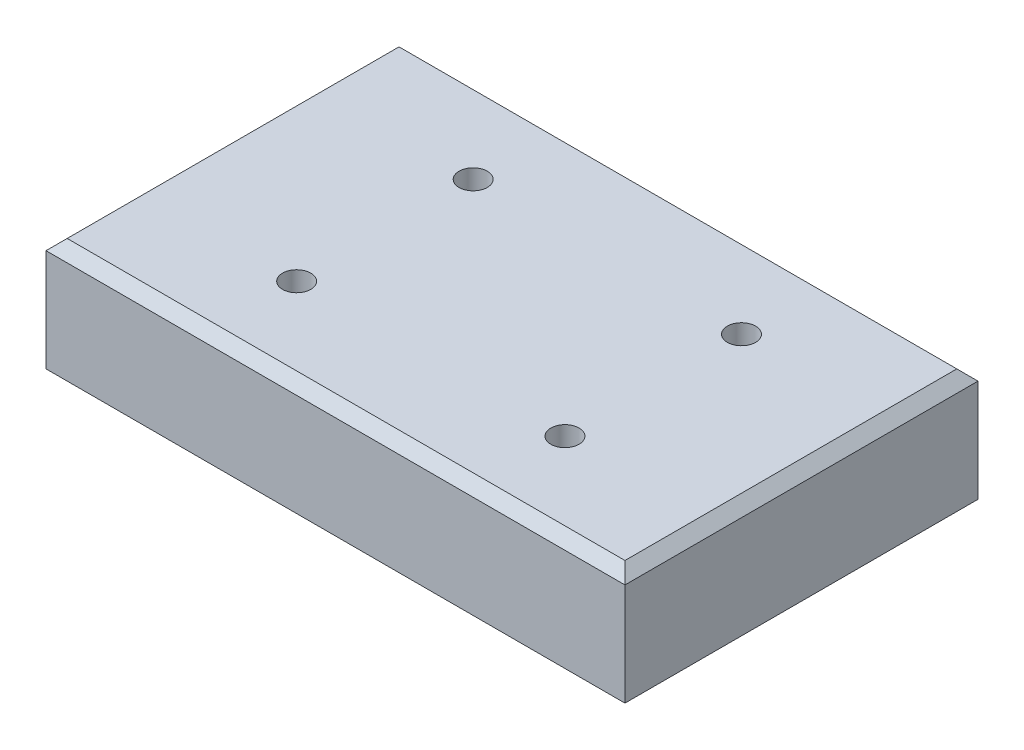
ISO-10303-21;
HEADER;
FILE_DESCRIPTION(('STEP AP214'),'2;1');
FILE_NAME('part.step','',(''),(''),'','','');
FILE_SCHEMA(('AUTOMOTIVE_DESIGN { 1 0 10303 214 1 1 1 1 }'));
ENDSEC;
DATA;
#1=APPLICATION_CONTEXT('core data for automotive mechanical design processes');
#2=APPLICATION_PROTOCOL_DEFINITION('international standard','automotive_design',2000,#1);
#3=PRODUCT_CONTEXT('',#1,'mechanical');
#4=PRODUCT('Part','Part','',(#3));
#5=PRODUCT_RELATED_PRODUCT_CATEGORY('part','',(#4));
#6=PRODUCT_DEFINITION_FORMATION('','',#4);
#7=PRODUCT_DEFINITION_CONTEXT('part definition',#1,'design');
#8=PRODUCT_DEFINITION('design','',#6,#7);
#9=PRODUCT_DEFINITION_SHAPE('','',#8);
#10=(LENGTH_UNIT() NAMED_UNIT(*) SI_UNIT(.MILLI.,.METRE.));
#11=(NAMED_UNIT(*) PLANE_ANGLE_UNIT() SI_UNIT($,.RADIAN.));
#12=(NAMED_UNIT(*) SI_UNIT($,.STERADIAN.) SOLID_ANGLE_UNIT());
#13=UNCERTAINTY_MEASURE_WITH_UNIT(LENGTH_MEASURE(1.E-05),#10,'distance_accuracy_value','');
#14=(GEOMETRIC_REPRESENTATION_CONTEXT(3) GLOBAL_UNCERTAINTY_ASSIGNED_CONTEXT((#13)) GLOBAL_UNIT_ASSIGNED_CONTEXT((#10,
#11,#12)) REPRESENTATION_CONTEXT('',''));
#15=CARTESIAN_POINT('',(0.,0.,0.));
#16=DIRECTION('',(0.,0.,1.));
#17=DIRECTION('',(1.,0.,0.));
#18=AXIS2_PLACEMENT_3D('',#15,#16,#17);
#19=CARTESIAN_POINT('',(-41.,8.,-25.));
#20=DIRECTION('',(1.,0.,0.));
#21=DIRECTION('',(0.,0.,-1.));
#22=AXIS2_PLACEMENT_3D('',#19,#20,#21);
#23=PLANE('',#22);
#24=DIRECTION('',(0.,-1.,0.));
#25=VECTOR('',#24,1.);
#26=CARTESIAN_POINT('',(-41.,8.,25.));
#27=LINE('',#26,#25);
#28=CARTESIAN_POINT('',(-41.,6.49999999999998,25.));
#29=VERTEX_POINT('',#28);
#30=CARTESIAN_POINT('',(-41.,-8.,25.));
#31=VERTEX_POINT('',#30);
#32=EDGE_CURVE('E182',#29,#31,#27,.T.);
#33=ORIENTED_EDGE('',*,*,#32,.F.);
#34=DIRECTION('',(0.,0.,-1.));
#35=VECTOR('',#34,1.);
#36=CARTESIAN_POINT('',(-41.,6.49999999999998,-25.));
#37=LINE('',#36,#35);
#38=CARTESIAN_POINT('',(-41.,6.49999999999998,-25.));
#39=VERTEX_POINT('',#38);
#40=EDGE_CURVE('E193',#29,#39,#37,.T.);
#41=ORIENTED_EDGE('',*,*,#40,.T.);
#42=DIRECTION('',(0.,-1.,0.));
#43=VECTOR('',#42,1.);
#44=CARTESIAN_POINT('',(-41.,8.,-25.));
#45=LINE('',#44,#43);
#46=CARTESIAN_POINT('',(-41.,-8.,-25.));
#47=VERTEX_POINT('',#46);
#48=EDGE_CURVE('E176',#39,#47,#45,.T.);
#49=ORIENTED_EDGE('',*,*,#48,.T.);
#50=DIRECTION('',(0.,0.,1.));
#51=VECTOR('',#50,1.);
#52=CARTESIAN_POINT('',(-41.,-8.,-25.));
#53=LINE('',#52,#51);
#54=EDGE_CURVE('E164',#47,#31,#53,.T.);
#55=ORIENTED_EDGE('',*,*,#54,.T.);
#56=EDGE_LOOP('',(#33,#41,#49,#55));
#57=FACE_BOUND('',#56,.T.);
#58=ADVANCED_FACE('F45',(#57),#23,.F.);
#59=CARTESIAN_POINT('',(41.,8.,25.));
#60=DIRECTION('',(0.,0.,-1.));
#61=DIRECTION('',(-1.,0.,0.));
#62=AXIS2_PLACEMENT_3D('',#59,#60,#61);
#63=PLANE('',#62);
#64=DIRECTION('',(0.,-1.,0.));
#65=VECTOR('',#64,1.);
#66=CARTESIAN_POINT('',(41.,8.,25.));
#67=LINE('',#66,#65);
#68=CARTESIAN_POINT('',(41.,6.49999999999998,25.));
#69=VERTEX_POINT('',#68);
#70=CARTESIAN_POINT('',(41.,-8.,25.));
#71=VERTEX_POINT('',#70);
#72=EDGE_CURVE('E180',#69,#71,#67,.T.);
#73=ORIENTED_EDGE('',*,*,#72,.F.);
#74=DIRECTION('',(-1.,0.,0.));
#75=VECTOR('',#74,1.);
#76=CARTESIAN_POINT('',(41.,6.49999999999998,25.));
#77=LINE('',#76,#75);
#78=EDGE_CURVE('E11',#69,#29,#77,.T.);
#79=ORIENTED_EDGE('',*,*,#78,.T.);
#80=ORIENTED_EDGE('',*,*,#32,.T.);
#81=DIRECTION('',(1.,0.,0.));
#82=VECTOR('',#81,1.);
#83=CARTESIAN_POINT('',(41.,-8.,25.));
#84=LINE('',#83,#82);
#85=EDGE_CURVE('E167',#31,#71,#84,.T.);
#86=ORIENTED_EDGE('',*,*,#85,.T.);
#87=EDGE_LOOP('',(#73,#79,#80,#86));
#88=FACE_BOUND('',#87,.T.);
#89=ADVANCED_FACE('F218',(#88),#63,.F.);
#90=CARTESIAN_POINT('',(41.,8.,-25.));
#91=DIRECTION('',(-1.,0.,0.));
#92=DIRECTION('',(0.,0.,1.));
#93=AXIS2_PLACEMENT_3D('',#90,#91,#92);
#94=PLANE('',#93);
#95=DIRECTION('',(0.,-1.,0.));
#96=VECTOR('',#95,1.);
#97=CARTESIAN_POINT('',(41.,8.,-25.));
#98=LINE('',#97,#96);
#99=CARTESIAN_POINT('',(41.,6.49999999999998,-25.));
#100=VERTEX_POINT('',#99);
#101=CARTESIAN_POINT('',(41.,-8.,-25.));
#102=VERTEX_POINT('',#101);
#103=EDGE_CURVE('E178',#100,#102,#98,.T.);
#104=ORIENTED_EDGE('',*,*,#103,.F.);
#105=DIRECTION('',(0.,0.,1.));
#106=VECTOR('',#105,1.);
#107=CARTESIAN_POINT('',(41.,6.49999999999998,-25.));
#108=LINE('',#107,#106);
#109=EDGE_CURVE('E55',#100,#69,#108,.T.);
#110=ORIENTED_EDGE('',*,*,#109,.T.);
#111=ORIENTED_EDGE('',*,*,#72,.T.);
#112=DIRECTION('',(0.,0.,-1.));
#113=VECTOR('',#112,1.);
#114=CARTESIAN_POINT('',(41.,-8.,-25.));
#115=LINE('',#114,#113);
#116=EDGE_CURVE('E170',#71,#102,#115,.T.);
#117=ORIENTED_EDGE('',*,*,#116,.T.);
#118=EDGE_LOOP('',(#104,#110,#111,#117));
#119=FACE_BOUND('',#118,.T.);
#120=ADVANCED_FACE('F241',(#119),#94,.F.);
#121=CARTESIAN_POINT('',(41.,8.,-25.));
#122=DIRECTION('',(0.,0.,1.));
#123=DIRECTION('',(1.,0.,0.));
#124=AXIS2_PLACEMENT_3D('',#121,#122,#123);
#125=PLANE('',#124);
#126=ORIENTED_EDGE('',*,*,#48,.F.);
#127=DIRECTION('',(1.,0.,0.));
#128=VECTOR('',#127,1.);
#129=CARTESIAN_POINT('',(41.,6.49999999999998,-25.));
#130=LINE('',#129,#128);
#131=EDGE_CURVE('E70',#39,#100,#130,.T.);
#132=ORIENTED_EDGE('',*,*,#131,.T.);
#133=ORIENTED_EDGE('',*,*,#103,.T.);
#134=DIRECTION('',(-1.,0.,0.));
#135=VECTOR('',#134,1.);
#136=CARTESIAN_POINT('',(41.,-8.,-25.));
#137=LINE('',#136,#135);
#138=EDGE_CURVE('E173',#102,#47,#137,.T.);
#139=ORIENTED_EDGE('',*,*,#138,.T.);
#140=EDGE_LOOP('',(#126,#132,#133,#139));
#141=FACE_BOUND('',#140,.T.);
#142=ADVANCED_FACE('F230',(#141),#125,.F.);
#143=CARTESIAN_POINT('',(0.,8.,0.));
#144=DIRECTION('',(0.,-1.,0.));
#145=DIRECTION('',(0.,0.,-1.));
#146=AXIS2_PLACEMENT_3D('',#143,#144,#145);
#147=PLANE('',#146);
#148=CARTESIAN_POINT('',(-18.,8.,-12.5));
#149=DIRECTION('',(0.,1.,0.));
#150=DIRECTION('',(0.,0.,1.));
#151=AXIS2_PLACEMENT_3D('',#148,#149,#150);
#152=CIRCLE('',#151,2.);
#153=CARTESIAN_POINT('',(-18.,8.,-10.5));
#154=VERTEX_POINT('',#153);
#155=EDGE_CURVE('E493',#154,#154,#152,.T.);
#156=ORIENTED_EDGE('',*,*,#155,.F.);
#157=EDGE_LOOP('',(#156));
#158=FACE_BOUND('',#157,.T.);
#159=CARTESIAN_POINT('',(-18.,8.,12.5));
#160=DIRECTION('',(0.,1.,0.));
#161=DIRECTION('',(0.,0.,1.));
#162=AXIS2_PLACEMENT_3D('',#159,#160,#161);
#163=CIRCLE('',#162,2.);
#164=CARTESIAN_POINT('',(-18.,8.,14.5));
#165=VERTEX_POINT('',#164);
#166=EDGE_CURVE('E120',#165,#165,#163,.T.);
#167=ORIENTED_EDGE('',*,*,#166,.F.);
#168=EDGE_LOOP('',(#167));
#169=FACE_BOUND('',#168,.T.);
#170=CARTESIAN_POINT('',(20.,8.,12.5));
#171=DIRECTION('',(0.,1.,0.));
#172=DIRECTION('',(0.,0.,1.));
#173=AXIS2_PLACEMENT_3D('',#170,#171,#172);
#174=CIRCLE('',#173,2.);
#175=CARTESIAN_POINT('',(20.,8.,14.5));
#176=VERTEX_POINT('',#175);
#177=EDGE_CURVE('E139',#176,#176,#174,.T.);
#178=ORIENTED_EDGE('',*,*,#177,.F.);
#179=EDGE_LOOP('',(#178));
#180=FACE_BOUND('',#179,.T.);
#181=CARTESIAN_POINT('',(20.,8.,-12.5));
#182=DIRECTION('',(0.,1.,0.));
#183=DIRECTION('',(0.,0.,1.));
#184=AXIS2_PLACEMENT_3D('',#181,#182,#183);
#185=CIRCLE('',#184,2.);
#186=CARTESIAN_POINT('',(20.,8.,-10.5));
#187=VERTEX_POINT('',#186);
#188=EDGE_CURVE('E151',#187,#187,#185,.T.);
#189=ORIENTED_EDGE('',*,*,#188,.F.);
#190=EDGE_LOOP('',(#189));
#191=FACE_BOUND('',#190,.T.);
#192=DIRECTION('',(-1.,0.,0.));
#193=VECTOR('',#192,1.);
#194=CARTESIAN_POINT('',(0.,8.,-23.5));
#195=LINE('',#194,#193);
#196=CARTESIAN_POINT('',(39.5,8.,-23.5));
#197=VERTEX_POINT('',#196);
#198=CARTESIAN_POINT('',(-39.5,8.,-23.5));
#199=VERTEX_POINT('',#198);
#200=EDGE_CURVE('E188',#197,#199,#195,.T.);
#201=ORIENTED_EDGE('',*,*,#200,.T.);
#202=DIRECTION('',(0.,0.,1.));
#203=VECTOR('',#202,1.);
#204=CARTESIAN_POINT('',(-39.5,8.,0.));
#205=LINE('',#204,#203);
#206=CARTESIAN_POINT('',(-39.5,8.,23.5));
#207=VERTEX_POINT('',#206);
#208=EDGE_CURVE('E190',#199,#207,#205,.T.);
#209=ORIENTED_EDGE('',*,*,#208,.T.);
#210=DIRECTION('',(1.,0.,0.));
#211=VECTOR('',#210,1.);
#212=CARTESIAN_POINT('',(0.,8.,23.5));
#213=LINE('',#212,#211);
#214=CARTESIAN_POINT('',(39.5,8.,23.5));
#215=VERTEX_POINT('',#214);
#216=EDGE_CURVE('E184',#207,#215,#213,.T.);
#217=ORIENTED_EDGE('',*,*,#216,.T.);
#218=DIRECTION('',(0.,0.,-1.));
#219=VECTOR('',#218,1.);
#220=CARTESIAN_POINT('',(39.5,8.,0.));
#221=LINE('',#220,#219);
#222=EDGE_CURVE('E186',#215,#197,#221,.T.);
#223=ORIENTED_EDGE('',*,*,#222,.T.);
#224=EDGE_LOOP('',(#201,#209,#217,#223));
#225=FACE_BOUND('',#224,.T.);
#226=ADVANCED_FACE('F227',(#158,#169,#180,#191,#225),#147,.F.);
#227=CARTESIAN_POINT('',(0.,-8.,0.));
#228=DIRECTION('',(0.,-1.,0.));
#229=DIRECTION('',(0.,0.,-1.));
#230=AXIS2_PLACEMENT_3D('',#227,#228,#229);
#231=PLANE('',#230);
#232=ORIENTED_EDGE('',*,*,#54,.F.);
#233=ORIENTED_EDGE('',*,*,#138,.F.);
#234=ORIENTED_EDGE('',*,*,#116,.F.);
#235=ORIENTED_EDGE('',*,*,#85,.F.);
#236=EDGE_LOOP('',(#232,#233,#234,#235));
#237=FACE_BOUND('',#236,.T.);
#238=ADVANCED_FACE('F229',(#237),#231,.T.);
#239=CARTESIAN_POINT('',(39.5,8.,0.));
#240=DIRECTION('',(-0.707106781186551,-0.707106781186544,0.));
#241=DIRECTION('',(0.,0.,-1.));
#242=AXIS2_PLACEMENT_3D('',#239,#240,#241);
#243=PLANE('',#242);
#244=DIRECTION('',(-0.577350269189624,0.577350269189629,-0.577350269189624));
#245=VECTOR('',#244,1.);
#246=CARTESIAN_POINT('',(26.3333333333334,21.1666666666667,10.3333333333334));
#247=LINE('',#246,#245);
#248=EDGE_CURVE('E200',#69,#215,#247,.T.);
#249=ORIENTED_EDGE('',*,*,#248,.F.);
#250=ORIENTED_EDGE('',*,*,#109,.F.);
#251=DIRECTION('',(-0.577350269189624,0.577350269189629,0.577350269189624));
#252=VECTOR('',#251,1.);
#253=CARTESIAN_POINT('',(31.6666666666667,15.8333333333334,-15.6666666666667));
#254=LINE('',#253,#252);
#255=EDGE_CURVE('E50',#197,#100,#254,.F.);
#256=ORIENTED_EDGE('',*,*,#255,.F.);
#257=ORIENTED_EDGE('',*,*,#222,.F.);
#258=EDGE_LOOP('',(#249,#250,#256,#257));
#259=FACE_BOUND('',#258,.T.);
#260=ADVANCED_FACE('F48',(#259),#243,.F.);
#261=CARTESIAN_POINT('',(0.,8.,-23.5));
#262=DIRECTION('',(0.,-0.707106781186544,0.707106781186551));
#263=DIRECTION('',(-1.,0.,0.));
#264=AXIS2_PLACEMENT_3D('',#261,#262,#263);
#265=PLANE('',#264);
#266=ORIENTED_EDGE('',*,*,#255,.T.);
#267=ORIENTED_EDGE('',*,*,#131,.F.);
#268=DIRECTION('',(0.577350269189623,0.57735026918963,0.577350269189624));
#269=VECTOR('',#268,1.);
#270=CARTESIAN_POINT('',(-26.3333333333335,21.1666666666667,-10.3333333333334));
#271=LINE('',#270,#269);
#272=EDGE_CURVE('E199',#199,#39,#271,.F.);
#273=ORIENTED_EDGE('',*,*,#272,.F.);
#274=ORIENTED_EDGE('',*,*,#200,.F.);
#275=EDGE_LOOP('',(#266,#267,#273,#274));
#276=FACE_BOUND('',#275,.T.);
#277=ADVANCED_FACE('F210',(#276),#265,.F.);
#278=CARTESIAN_POINT('',(0.,8.,23.5));
#279=DIRECTION('',(0.,-0.707106781186544,-0.707106781186551));
#280=DIRECTION('',(1.,0.,0.));
#281=AXIS2_PLACEMENT_3D('',#278,#279,#280);
#282=PLANE('',#281);
#283=ORIENTED_EDGE('',*,*,#248,.T.);
#284=ORIENTED_EDGE('',*,*,#216,.F.);
#285=DIRECTION('',(-0.577350269189623,-0.57735026918963,0.577350269189625));
#286=VECTOR('',#285,1.);
#287=CARTESIAN_POINT('',(-26.3333333333334,21.1666666666667,10.3333333333334));
#288=LINE('',#287,#286);
#289=EDGE_CURVE('E163',#29,#207,#288,.F.);
#290=ORIENTED_EDGE('',*,*,#289,.F.);
#291=ORIENTED_EDGE('',*,*,#78,.F.);
#292=EDGE_LOOP('',(#283,#284,#290,#291));
#293=FACE_BOUND('',#292,.T.);
#294=ADVANCED_FACE('F215',(#293),#282,.F.);
#295=CARTESIAN_POINT('',(-39.5,8.,0.));
#296=DIRECTION('',(0.707106781186552,-0.707106781186543,0.));
#297=DIRECTION('',(0.,0.,1.));
#298=AXIS2_PLACEMENT_3D('',#295,#296,#297);
#299=PLANE('',#298);
#300=ORIENTED_EDGE('',*,*,#272,.T.);
#301=ORIENTED_EDGE('',*,*,#40,.F.);
#302=ORIENTED_EDGE('',*,*,#289,.T.);
#303=ORIENTED_EDGE('',*,*,#208,.F.);
#304=EDGE_LOOP('',(#300,#301,#302,#303));
#305=FACE_BOUND('',#304,.T.);
#306=ADVANCED_FACE('F224',(#305),#299,.F.);
#307=CARTESIAN_POINT('',(20.,0.,-12.5));
#308=DIRECTION('',(0.,1.,0.));
#309=DIRECTION('',(0.,0.,1.));
#310=AXIS2_PLACEMENT_3D('',#307,#308,#309);
#311=CONICAL_SURFACE('',#310,1.5,1.02974425867665);
#312=CARTESIAN_POINT('',(20.,-0.901290928541342,-12.5));
#313=VERTEX_POINT('',#312);
#314=VERTEX_LOOP('',#313);
#315=FACE_BOUND('',#314,.T.);
#316=CARTESIAN_POINT('',(20.,0.,-12.5));
#317=DIRECTION('',(0.,1.,0.));
#318=DIRECTION('',(0.,0.,1.));
#319=AXIS2_PLACEMENT_3D('',#316,#317,#318);
#320=CIRCLE('',#319,1.5);
#321=CARTESIAN_POINT('',(20.,0.,-11.));
#322=VERTEX_POINT('',#321);
#323=EDGE_CURVE('E160',#322,#322,#320,.T.);
#324=ORIENTED_EDGE('',*,*,#323,.T.);
#325=EDGE_LOOP('',(#324));
#326=FACE_BOUND('',#325,.T.);
#327=ADVANCED_FACE('F259',(#315,#326),#311,.F.);
#328=CARTESIAN_POINT('',(20.,8.,-12.5));
#329=DIRECTION('',(0.,1.,0.));
#330=DIRECTION('',(0.,0.,1.));
#331=AXIS2_PLACEMENT_3D('',#328,#329,#330);
#332=CYLINDRICAL_SURFACE('',#331,1.5);
#333=ORIENTED_EDGE('',*,*,#323,.F.);
#334=EDGE_LOOP('',(#333));
#335=FACE_BOUND('',#334,.T.);
#336=CARTESIAN_POINT('',(20.,2.,-12.5));
#337=DIRECTION('',(0.,1.,0.));
#338=DIRECTION('',(0.,0.,1.));
#339=AXIS2_PLACEMENT_3D('',#336,#337,#338);
#340=CIRCLE('',#339,1.5);
#341=CARTESIAN_POINT('',(20.,2.,-11.));
#342=VERTEX_POINT('',#341);
#343=EDGE_CURVE('E157',#342,#342,#340,.T.);
#344=ORIENTED_EDGE('',*,*,#343,.T.);
#345=EDGE_LOOP('',(#344));
#346=FACE_BOUND('',#345,.T.);
#347=ADVANCED_FACE('F312',(#335,#346),#332,.F.);
#348=CARTESIAN_POINT('',(21.5,2.,-12.5));
#349=DIRECTION('',(0.,-1.,0.));
#350=DIRECTION('',(0.,0.,-1.));
#351=AXIS2_PLACEMENT_3D('',#348,#349,#350);
#352=PLANE('',#351);
#353=ORIENTED_EDGE('',*,*,#343,.F.);
#354=EDGE_LOOP('',(#353));
#355=FACE_BOUND('',#354,.T.);
#356=CARTESIAN_POINT('',(20.,2.,-12.5));
#357=DIRECTION('',(0.,1.,0.));
#358=DIRECTION('',(0.,0.,1.));
#359=AXIS2_PLACEMENT_3D('',#356,#357,#358);
#360=CIRCLE('',#359,2.);
#361=CARTESIAN_POINT('',(20.,2.,-10.5));
#362=VERTEX_POINT('',#361);
#363=EDGE_CURVE('E154',#362,#362,#360,.T.);
#364=ORIENTED_EDGE('',*,*,#363,.T.);
#365=EDGE_LOOP('',(#364));
#366=FACE_BOUND('',#365,.T.);
#367=ADVANCED_FACE('F321',(#355,#366),#352,.F.);
#368=CARTESIAN_POINT('',(20.,8.,-12.5));
#369=DIRECTION('',(0.,1.,0.));
#370=DIRECTION('',(0.,0.,1.));
#371=AXIS2_PLACEMENT_3D('',#368,#369,#370);
#372=CYLINDRICAL_SURFACE('',#371,2.);
#373=ORIENTED_EDGE('',*,*,#363,.F.);
#374=EDGE_LOOP('',(#373));
#375=FACE_BOUND('',#374,.T.);
#376=ORIENTED_EDGE('',*,*,#188,.T.);
#377=EDGE_LOOP('',(#376));
#378=FACE_BOUND('',#377,.T.);
#379=ADVANCED_FACE('F331',(#375,#378),#372,.F.);
#380=CARTESIAN_POINT('',(20.,0.,12.5));
#381=DIRECTION('',(0.,1.,0.));
#382=DIRECTION('',(0.,0.,1.));
#383=AXIS2_PLACEMENT_3D('',#380,#381,#382);
#384=CONICAL_SURFACE('',#383,1.5,1.02974425867665);
#385=CARTESIAN_POINT('',(20.,-0.901290928541342,12.5));
#386=VERTEX_POINT('',#385);
#387=VERTEX_LOOP('',#386);
#388=FACE_BOUND('',#387,.T.);
#389=CARTESIAN_POINT('',(20.,0.,12.5));
#390=DIRECTION('',(0.,1.,0.));
#391=DIRECTION('',(0.,0.,1.));
#392=AXIS2_PLACEMENT_3D('',#389,#390,#391);
#393=CIRCLE('',#392,1.5);
#394=CARTESIAN_POINT('',(20.,0.,14.));
#395=VERTEX_POINT('',#394);
#396=EDGE_CURVE('E148',#395,#395,#393,.T.);
#397=ORIENTED_EDGE('',*,*,#396,.T.);
#398=EDGE_LOOP('',(#397));
#399=FACE_BOUND('',#398,.T.);
#400=ADVANCED_FACE('F341',(#388,#399),#384,.F.);
#401=CARTESIAN_POINT('',(20.,8.,12.5));
#402=DIRECTION('',(0.,1.,0.));
#403=DIRECTION('',(0.,0.,1.));
#404=AXIS2_PLACEMENT_3D('',#401,#402,#403);
#405=CYLINDRICAL_SURFACE('',#404,1.5);
#406=ORIENTED_EDGE('',*,*,#396,.F.);
#407=EDGE_LOOP('',(#406));
#408=FACE_BOUND('',#407,.T.);
#409=CARTESIAN_POINT('',(20.,2.,12.5));
#410=DIRECTION('',(0.,1.,0.));
#411=DIRECTION('',(0.,0.,1.));
#412=AXIS2_PLACEMENT_3D('',#409,#410,#411);
#413=CIRCLE('',#412,1.5);
#414=CARTESIAN_POINT('',(20.,2.,14.));
#415=VERTEX_POINT('',#414);
#416=EDGE_CURVE('E145',#415,#415,#413,.T.);
#417=ORIENTED_EDGE('',*,*,#416,.T.);
#418=EDGE_LOOP('',(#417));
#419=FACE_BOUND('',#418,.T.);
#420=ADVANCED_FACE('F351',(#408,#419),#405,.F.);
#421=CARTESIAN_POINT('',(21.5,2.,12.5));
#422=DIRECTION('',(0.,-1.,0.));
#423=DIRECTION('',(0.,0.,-1.));
#424=AXIS2_PLACEMENT_3D('',#421,#422,#423);
#425=PLANE('',#424);
#426=ORIENTED_EDGE('',*,*,#416,.F.);
#427=EDGE_LOOP('',(#426));
#428=FACE_BOUND('',#427,.T.);
#429=CARTESIAN_POINT('',(20.,2.,12.5));
#430=DIRECTION('',(0.,1.,0.));
#431=DIRECTION('',(0.,0.,1.));
#432=AXIS2_PLACEMENT_3D('',#429,#430,#431);
#433=CIRCLE('',#432,2.);
#434=CARTESIAN_POINT('',(20.,2.,14.5));
#435=VERTEX_POINT('',#434);
#436=EDGE_CURVE('E142',#435,#435,#433,.T.);
#437=ORIENTED_EDGE('',*,*,#436,.T.);
#438=EDGE_LOOP('',(#437));
#439=FACE_BOUND('',#438,.T.);
#440=ADVANCED_FACE('F361',(#428,#439),#425,.F.);
#441=CARTESIAN_POINT('',(20.,8.,12.5));
#442=DIRECTION('',(0.,1.,0.));
#443=DIRECTION('',(0.,0.,1.));
#444=AXIS2_PLACEMENT_3D('',#441,#442,#443);
#445=CYLINDRICAL_SURFACE('',#444,2.);
#446=ORIENTED_EDGE('',*,*,#436,.F.);
#447=EDGE_LOOP('',(#446));
#448=FACE_BOUND('',#447,.T.);
#449=ORIENTED_EDGE('',*,*,#177,.T.);
#450=EDGE_LOOP('',(#449));
#451=FACE_BOUND('',#450,.T.);
#452=ADVANCED_FACE('F371',(#448,#451),#445,.F.);
#453=CARTESIAN_POINT('',(-18.,0.,12.5));
#454=DIRECTION('',(0.,1.,0.));
#455=DIRECTION('',(0.,0.,1.));
#456=AXIS2_PLACEMENT_3D('',#453,#454,#455);
#457=CONICAL_SURFACE('',#456,1.5,1.02974425867665);
#458=CARTESIAN_POINT('',(-18.,-0.901290928541342,12.5));
#459=VERTEX_POINT('',#458);
#460=VERTEX_LOOP('',#459);
#461=FACE_BOUND('',#460,.T.);
#462=CARTESIAN_POINT('',(-18.,0.,12.5));
#463=DIRECTION('',(0.,1.,0.));
#464=DIRECTION('',(0.,0.,1.));
#465=AXIS2_PLACEMENT_3D('',#462,#463,#464);
#466=CIRCLE('',#465,1.5);
#467=CARTESIAN_POINT('',(-18.,0.,14.));
#468=VERTEX_POINT('',#467);
#469=EDGE_CURVE('E136',#468,#468,#466,.T.);
#470=ORIENTED_EDGE('',*,*,#469,.T.);
#471=EDGE_LOOP('',(#470));
#472=FACE_BOUND('',#471,.T.);
#473=ADVANCED_FACE('F381',(#461,#472),#457,.F.);
#474=CARTESIAN_POINT('',(-18.,8.,12.5));
#475=DIRECTION('',(0.,1.,0.));
#476=DIRECTION('',(0.,0.,1.));
#477=AXIS2_PLACEMENT_3D('',#474,#475,#476);
#478=CYLINDRICAL_SURFACE('',#477,1.5);
#479=ORIENTED_EDGE('',*,*,#469,.F.);
#480=EDGE_LOOP('',(#479));
#481=FACE_BOUND('',#480,.T.);
#482=CARTESIAN_POINT('',(-18.,2.,12.5));
#483=DIRECTION('',(0.,1.,0.));
#484=DIRECTION('',(0.,0.,1.));
#485=AXIS2_PLACEMENT_3D('',#482,#483,#484);
#486=CIRCLE('',#485,1.5);
#487=CARTESIAN_POINT('',(-18.,2.,14.));
#488=VERTEX_POINT('',#487);
#489=EDGE_CURVE('E133',#488,#488,#486,.T.);
#490=ORIENTED_EDGE('',*,*,#489,.T.);
#491=EDGE_LOOP('',(#490));
#492=FACE_BOUND('',#491,.T.);
#493=ADVANCED_FACE('F391',(#481,#492),#478,.F.);
#494=CARTESIAN_POINT('',(-16.5,2.,12.5));
#495=DIRECTION('',(0.,-1.,0.));
#496=DIRECTION('',(0.,0.,-1.));
#497=AXIS2_PLACEMENT_3D('',#494,#495,#496);
#498=PLANE('',#497);
#499=ORIENTED_EDGE('',*,*,#489,.F.);
#500=EDGE_LOOP('',(#499));
#501=FACE_BOUND('',#500,.T.);
#502=CARTESIAN_POINT('',(-18.,2.,12.5));
#503=DIRECTION('',(0.,1.,0.));
#504=DIRECTION('',(0.,0.,1.));
#505=AXIS2_PLACEMENT_3D('',#502,#503,#504);
#506=CIRCLE('',#505,2.);
#507=CARTESIAN_POINT('',(-18.,2.,14.5));
#508=VERTEX_POINT('',#507);
#509=EDGE_CURVE('E124',#508,#508,#506,.T.);
#510=ORIENTED_EDGE('',*,*,#509,.T.);
#511=EDGE_LOOP('',(#510));
#512=FACE_BOUND('',#511,.T.);
#513=ADVANCED_FACE('F401',(#501,#512),#498,.F.);
#514=CARTESIAN_POINT('',(-18.,8.,12.5));
#515=DIRECTION('',(0.,1.,0.));
#516=DIRECTION('',(0.,0.,1.));
#517=AXIS2_PLACEMENT_3D('',#514,#515,#516);
#518=CYLINDRICAL_SURFACE('',#517,2.);
#519=ORIENTED_EDGE('',*,*,#509,.F.);
#520=EDGE_LOOP('',(#519));
#521=FACE_BOUND('',#520,.T.);
#522=ORIENTED_EDGE('',*,*,#166,.T.);
#523=EDGE_LOOP('',(#522));
#524=FACE_BOUND('',#523,.T.);
#525=ADVANCED_FACE('F114',(#521,#524),#518,.F.);
#526=CARTESIAN_POINT('',(-18.,0.,-12.5));
#527=DIRECTION('',(0.,1.,0.));
#528=DIRECTION('',(0.,0.,1.));
#529=AXIS2_PLACEMENT_3D('',#526,#527,#528);
#530=CONICAL_SURFACE('',#529,1.5,1.02974425867665);
#531=CARTESIAN_POINT('',(-18.,-0.901290928541342,-12.5));
#532=VERTEX_POINT('',#531);
#533=VERTEX_LOOP('',#532);
#534=FACE_BOUND('',#533,.T.);
#535=CARTESIAN_POINT('',(-18.,0.,-12.5));
#536=DIRECTION('',(0.,1.,0.));
#537=DIRECTION('',(0.,0.,1.));
#538=AXIS2_PLACEMENT_3D('',#535,#536,#537);
#539=CIRCLE('',#538,1.5);
#540=CARTESIAN_POINT('',(-18.,0.,-11.));
#541=VERTEX_POINT('',#540);
#542=EDGE_CURVE('E118',#541,#541,#539,.T.);
#543=ORIENTED_EDGE('',*,*,#542,.T.);
#544=EDGE_LOOP('',(#543));
#545=FACE_BOUND('',#544,.T.);
#546=ADVANCED_FACE('F110',(#534,#545),#530,.F.);
#547=CARTESIAN_POINT('',(-18.,8.,-12.5));
#548=DIRECTION('',(0.,1.,0.));
#549=DIRECTION('',(0.,0.,1.));
#550=AXIS2_PLACEMENT_3D('',#547,#548,#549);
#551=CYLINDRICAL_SURFACE('',#550,1.5);
#552=ORIENTED_EDGE('',*,*,#542,.F.);
#553=EDGE_LOOP('',(#552));
#554=FACE_BOUND('',#553,.T.);
#555=CARTESIAN_POINT('',(-18.,2.,-12.5));
#556=DIRECTION('',(0.,1.,0.));
#557=DIRECTION('',(0.,0.,1.));
#558=AXIS2_PLACEMENT_3D('',#555,#556,#557);
#559=CIRCLE('',#558,1.5);
#560=CARTESIAN_POINT('',(-18.,2.,-11.));
#561=VERTEX_POINT('',#560);
#562=EDGE_CURVE('E121',#561,#561,#559,.T.);
#563=ORIENTED_EDGE('',*,*,#562,.T.);
#564=EDGE_LOOP('',(#563));
#565=FACE_BOUND('',#564,.T.);
#566=ADVANCED_FACE('F113',(#554,#565),#551,.F.);
#567=CARTESIAN_POINT('',(-16.5,2.,-12.5));
#568=DIRECTION('',(0.,-1.,0.));
#569=DIRECTION('',(0.,0.,-1.));
#570=AXIS2_PLACEMENT_3D('',#567,#568,#569);
#571=PLANE('',#570);
#572=ORIENTED_EDGE('',*,*,#562,.F.);
#573=EDGE_LOOP('',(#572));
#574=FACE_BOUND('',#573,.T.);
#575=CARTESIAN_POINT('',(-18.,2.,-12.5));
#576=DIRECTION('',(0.,1.,0.));
#577=DIRECTION('',(0.,0.,1.));
#578=AXIS2_PLACEMENT_3D('',#575,#576,#577);
#579=CIRCLE('',#578,2.);
#580=CARTESIAN_POINT('',(-18.,2.,-10.5));
#581=VERTEX_POINT('',#580);
#582=EDGE_CURVE('E127',#581,#581,#579,.T.);
#583=ORIENTED_EDGE('',*,*,#582,.T.);
#584=EDGE_LOOP('',(#583));
#585=FACE_BOUND('',#584,.T.);
#586=ADVANCED_FACE('F435',(#574,#585),#571,.F.);
#587=CARTESIAN_POINT('',(-18.,8.,-12.5));
#588=DIRECTION('',(0.,1.,0.));
#589=DIRECTION('',(0.,0.,1.));
#590=AXIS2_PLACEMENT_3D('',#587,#588,#589);
#591=CYLINDRICAL_SURFACE('',#590,2.);
#592=ORIENTED_EDGE('',*,*,#582,.F.);
#593=EDGE_LOOP('',(#592));
#594=FACE_BOUND('',#593,.T.);
#595=ORIENTED_EDGE('',*,*,#155,.T.);
#596=EDGE_LOOP('',(#595));
#597=FACE_BOUND('',#596,.T.);
#598=ADVANCED_FACE('F444',(#594,#597),#591,.F.);
#599=CLOSED_SHELL('',(#58,#89,#120,#142,#226,#238,#260,#277,#294,#306,#327,#347,#367,#379,#400,
#420,#440,#452,#473,#493,#513,#525,#546,#566,#586,#598));
#600=MANIFOLD_SOLID_BREP('B2',#599);
#601=ADVANCED_BREP_SHAPE_REPRESENTATION('',(#18,#600),#14);
#602=SHAPE_DEFINITION_REPRESENTATION(#9,#601);
ENDSEC;
END-ISO-10303-21;
